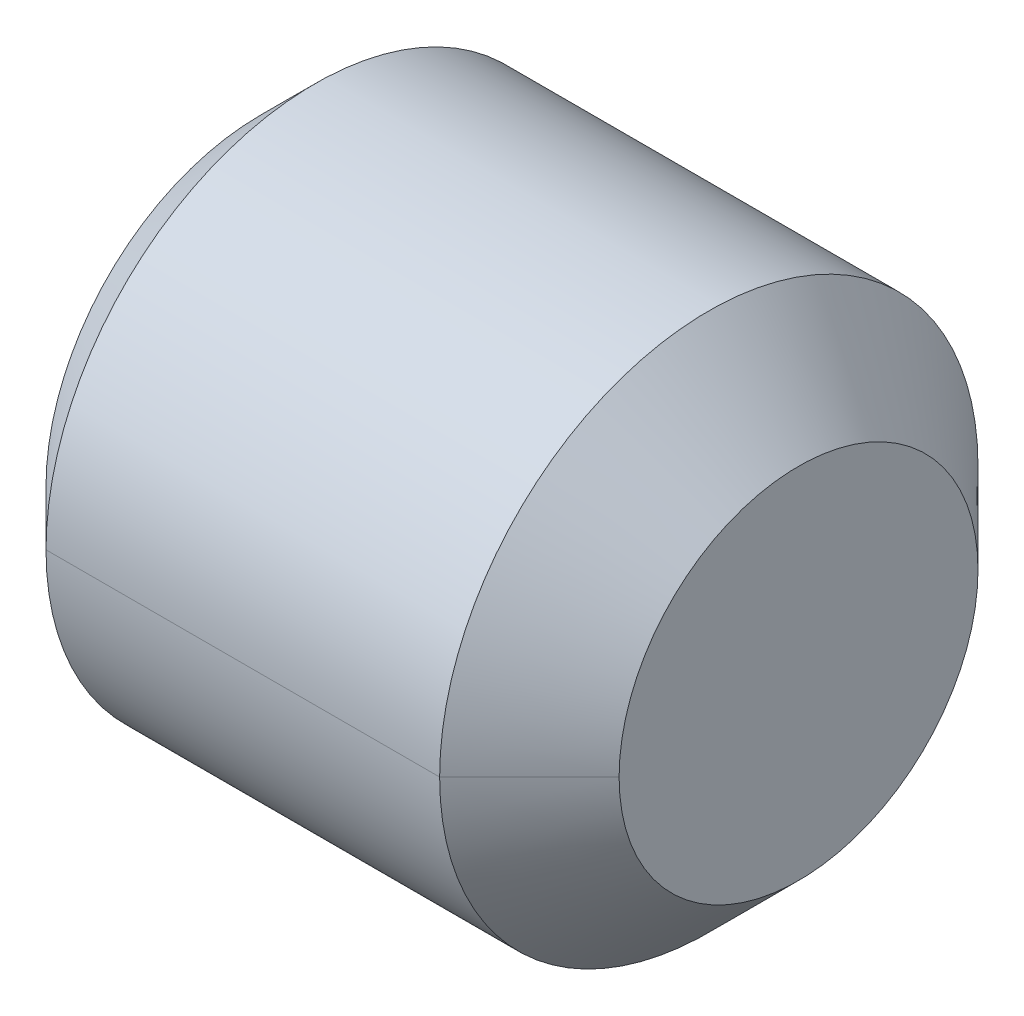
ISO-10303-21;
HEADER;
FILE_DESCRIPTION(('STEP AP214'),'2;1');
FILE_NAME('part.step','',(''),(''),'','','');
FILE_SCHEMA(('AUTOMOTIVE_DESIGN { 1 0 10303 214 1 1 1 1 }'));
ENDSEC;
DATA;
#1=APPLICATION_CONTEXT('core data for automotive mechanical design processes');
#2=APPLICATION_PROTOCOL_DEFINITION('international standard','automotive_design',2000,#1);
#3=PRODUCT_CONTEXT('',#1,'mechanical');
#4=PRODUCT('Part','Part','',(#3));
#5=PRODUCT_RELATED_PRODUCT_CATEGORY('part','',(#4));
#6=PRODUCT_DEFINITION_FORMATION('','',#4);
#7=PRODUCT_DEFINITION_CONTEXT('part definition',#1,'design');
#8=PRODUCT_DEFINITION('design','',#6,#7);
#9=PRODUCT_DEFINITION_SHAPE('','',#8);
#10=(LENGTH_UNIT() NAMED_UNIT(*) SI_UNIT(.MILLI.,.METRE.));
#11=(NAMED_UNIT(*) PLANE_ANGLE_UNIT() SI_UNIT($,.RADIAN.));
#12=(NAMED_UNIT(*) SI_UNIT($,.STERADIAN.) SOLID_ANGLE_UNIT());
#13=UNCERTAINTY_MEASURE_WITH_UNIT(LENGTH_MEASURE(1.E-05),#10,'distance_accuracy_value','');
#14=(GEOMETRIC_REPRESENTATION_CONTEXT(3) GLOBAL_UNCERTAINTY_ASSIGNED_CONTEXT((#13)) GLOBAL_UNIT_ASSIGNED_CONTEXT((#10,
#11,#12)) REPRESENTATION_CONTEXT('',''));
#15=CARTESIAN_POINT('',(0.,0.,0.));
#16=DIRECTION('',(0.,0.,1.));
#17=DIRECTION('',(1.,0.,0.));
#18=AXIS2_PLACEMENT_3D('',#15,#16,#17);
#19=CARTESIAN_POINT('',(-1.8,0.,0.));
#20=DIRECTION('',(-1.,0.,0.));
#21=DIRECTION('',(0.,0.,1.));
#22=AXIS2_PLACEMENT_3D('',#19,#20,#21);
#23=PLANE('',#22);
#24=DIRECTION('',(0.,0.866025403784438,0.5));
#25=VECTOR('',#24,1.);
#26=CARTESIAN_POINT('',(-1.8,-0.75,0.43301270189222));
#27=LINE('',#26,#25);
#28=CARTESIAN_POINT('',(-1.8,-0.75,0.43301270189222));
#29=VERTEX_POINT('',#28);
#30=CARTESIAN_POINT('',(-1.8,-0.375,0.64951905283833));
#31=VERTEX_POINT('',#30);
#32=EDGE_CURVE('E11',#29,#31,#27,.T.);
#33=ORIENTED_EDGE('',*,*,#32,.T.);
#34=CARTESIAN_POINT('',(-1.8,0.,0.));
#35=DIRECTION('',(1.,0.,0.));
#36=DIRECTION('',(0.,0.,1.));
#37=AXIS2_PLACEMENT_3D('',#34,#35,#36);
#38=CIRCLE('',#37,0.75);
#39=CARTESIAN_POINT('',(-1.8,-0.75,0.));
#40=VERTEX_POINT('',#39);
#41=EDGE_CURVE('E24',#31,#40,#38,.T.);
#42=ORIENTED_EDGE('',*,*,#41,.T.);
#43=DIRECTION('',(0.,0.,1.));
#44=VECTOR('',#43,1.);
#45=CARTESIAN_POINT('',(-1.8,-0.75,-0.43301270189222));
#46=LINE('',#45,#44);
#47=EDGE_CURVE('E333',#40,#29,#46,.T.);
#48=ORIENTED_EDGE('',*,*,#47,.T.);
#49=EDGE_LOOP('',(#33,#42,#48));
#50=FACE_BOUND('',#49,.T.);
#51=ADVANCED_FACE('F16',(#50),#23,.T.);
#52=CARTESIAN_POINT('',(-1.8,-0.75,-0.43301270189222));
#53=DIRECTION('',(0.,-1.,0.));
#54=DIRECTION('',(0.,0.,-1.));
#55=AXIS2_PLACEMENT_3D('',#52,#53,#54);
#56=PLANE('',#55);
#57=DIRECTION('',(0.,0.,1.));
#58=VECTOR('',#57,1.);
#59=CARTESIAN_POINT('',(-3.,-0.75,-0.43301270189222));
#60=LINE('',#59,#58);
#61=CARTESIAN_POINT('',(-3.,-0.75,-0.43301270189222));
#62=VERTEX_POINT('',#61);
#63=CARTESIAN_POINT('',(-3.,-0.75,0.43301270189222));
#64=VERTEX_POINT('',#63);
#65=EDGE_CURVE('E329',#62,#64,#60,.T.);
#66=ORIENTED_EDGE('',*,*,#65,.T.);
#67=DIRECTION('',(-1.,0.,0.));
#68=VECTOR('',#67,1.);
#69=CARTESIAN_POINT('',(-1.8,-0.75,0.43301270189222));
#70=LINE('',#69,#68);
#71=EDGE_CURVE('E324',#29,#64,#70,.T.);
#72=ORIENTED_EDGE('',*,*,#71,.F.);
#73=ORIENTED_EDGE('',*,*,#47,.F.);
#74=DIRECTION('',(0.,0.,1.));
#75=VECTOR('',#74,1.);
#76=CARTESIAN_POINT('',(-1.8,-0.75,-0.43301270189222));
#77=LINE('',#76,#75);
#78=CARTESIAN_POINT('',(-1.8,-0.75,-0.43301270189222));
#79=VERTEX_POINT('',#78);
#80=EDGE_CURVE('E319',#79,#40,#77,.T.);
#81=ORIENTED_EDGE('',*,*,#80,.F.);
#82=DIRECTION('',(-1.,0.,0.));
#83=VECTOR('',#82,1.);
#84=CARTESIAN_POINT('',(-1.8,-0.75,-0.43301270189222));
#85=LINE('',#84,#83);
#86=EDGE_CURVE('E315',#79,#62,#85,.T.);
#87=ORIENTED_EDGE('',*,*,#86,.T.);
#88=EDGE_LOOP('',(#66,#72,#73,#81,#87));
#89=FACE_BOUND('',#88,.T.);
#90=ADVANCED_FACE('F344',(#89),#56,.F.);
#91=CARTESIAN_POINT('',(-1.8,0.,-0.86602540378444));
#92=DIRECTION('',(0.,-0.5,-0.866025403784439));
#93=DIRECTION('',(0.,0.866025403784439,-0.5));
#94=AXIS2_PLACEMENT_3D('',#91,#92,#93);
#95=PLANE('',#94);
#96=DIRECTION('',(0.,-0.866025403784438,0.5));
#97=VECTOR('',#96,1.);
#98=CARTESIAN_POINT('',(-3.,0.,-0.86602540378444));
#99=LINE('',#98,#97);
#100=CARTESIAN_POINT('',(-3.,0.,-0.86602540378444));
#101=VERTEX_POINT('',#100);
#102=EDGE_CURVE('E310',#101,#62,#99,.T.);
#103=ORIENTED_EDGE('',*,*,#102,.T.);
#104=ORIENTED_EDGE('',*,*,#86,.F.);
#105=DIRECTION('',(0.,-0.866025403784438,0.5));
#106=VECTOR('',#105,1.);
#107=CARTESIAN_POINT('',(-1.8,0.,-0.86602540378444));
#108=LINE('',#107,#106);
#109=CARTESIAN_POINT('',(-1.8,-0.375,-0.649519052838329));
#110=VERTEX_POINT('',#109);
#111=EDGE_CURVE('E305',#110,#79,#108,.T.);
#112=ORIENTED_EDGE('',*,*,#111,.F.);
#113=DIRECTION('',(0.,-0.866025403784438,0.5));
#114=VECTOR('',#113,1.);
#115=CARTESIAN_POINT('',(-1.8,0.,-0.86602540378444));
#116=LINE('',#115,#114);
#117=CARTESIAN_POINT('',(-1.8,0.,-0.86602540378444));
#118=VERTEX_POINT('',#117);
#119=EDGE_CURVE('E300',#118,#110,#116,.T.);
#120=ORIENTED_EDGE('',*,*,#119,.F.);
#121=DIRECTION('',(-1.,0.,0.));
#122=VECTOR('',#121,1.);
#123=CARTESIAN_POINT('',(-1.8,0.,-0.86602540378444));
#124=LINE('',#123,#122);
#125=EDGE_CURVE('E296',#118,#101,#124,.T.);
#126=ORIENTED_EDGE('',*,*,#125,.T.);
#127=EDGE_LOOP('',(#103,#104,#112,#120,#126));
#128=FACE_BOUND('',#127,.T.);
#129=ADVANCED_FACE('F362',(#128),#95,.F.);
#130=CARTESIAN_POINT('',(-1.8,0.75,-0.43301270189222));
#131=DIRECTION('',(0.,0.5,-0.866025403784439));
#132=DIRECTION('',(0.,0.866025403784439,0.5));
#133=AXIS2_PLACEMENT_3D('',#130,#131,#132);
#134=PLANE('',#133);
#135=DIRECTION('',(0.,-0.866025403784438,-0.5));
#136=VECTOR('',#135,1.);
#137=CARTESIAN_POINT('',(-3.,0.75,-0.43301270189222));
#138=LINE('',#137,#136);
#139=CARTESIAN_POINT('',(-3.,0.75,-0.43301270189222));
#140=VERTEX_POINT('',#139);
#141=EDGE_CURVE('E291',#140,#101,#138,.T.);
#142=ORIENTED_EDGE('',*,*,#141,.T.);
#143=ORIENTED_EDGE('',*,*,#125,.F.);
#144=DIRECTION('',(0.,-0.866025403784438,-0.5));
#145=VECTOR('',#144,1.);
#146=CARTESIAN_POINT('',(-1.8,0.75,-0.43301270189222));
#147=LINE('',#146,#145);
#148=CARTESIAN_POINT('',(-1.8,0.375,-0.649519052838329));
#149=VERTEX_POINT('',#148);
#150=EDGE_CURVE('E286',#149,#118,#147,.T.);
#151=ORIENTED_EDGE('',*,*,#150,.F.);
#152=DIRECTION('',(0.,-0.866025403784438,-0.5));
#153=VECTOR('',#152,1.);
#154=CARTESIAN_POINT('',(-1.8,0.75,-0.43301270189222));
#155=LINE('',#154,#153);
#156=CARTESIAN_POINT('',(-1.8,0.75,-0.43301270189222));
#157=VERTEX_POINT('',#156);
#158=EDGE_CURVE('E281',#157,#149,#155,.T.);
#159=ORIENTED_EDGE('',*,*,#158,.F.);
#160=DIRECTION('',(-1.,0.,0.));
#161=VECTOR('',#160,1.);
#162=CARTESIAN_POINT('',(-1.8,0.75,-0.43301270189222));
#163=LINE('',#162,#161);
#164=EDGE_CURVE('E277',#157,#140,#163,.T.);
#165=ORIENTED_EDGE('',*,*,#164,.T.);
#166=EDGE_LOOP('',(#142,#143,#151,#159,#165));
#167=FACE_BOUND('',#166,.T.);
#168=ADVANCED_FACE('F382',(#167),#134,.F.);
#169=CARTESIAN_POINT('',(-1.8,0.75,0.43301270189222));
#170=DIRECTION('',(0.,1.,0.));
#171=DIRECTION('',(0.,0.,1.));
#172=AXIS2_PLACEMENT_3D('',#169,#170,#171);
#173=PLANE('',#172);
#174=DIRECTION('',(-1.,0.,0.));
#175=VECTOR('',#174,1.);
#176=CARTESIAN_POINT('',(-1.8,0.75,0.43301270189222));
#177=LINE('',#176,#175);
#178=CARTESIAN_POINT('',(-1.8,0.75,0.43301270189222));
#179=VERTEX_POINT('',#178);
#180=CARTESIAN_POINT('',(-3.,0.75,0.43301270189222));
#181=VERTEX_POINT('',#180);
#182=EDGE_CURVE('E273',#179,#181,#177,.T.);
#183=ORIENTED_EDGE('',*,*,#182,.T.);
#184=DIRECTION('',(0.,0.,1.));
#185=VECTOR('',#184,1.);
#186=CARTESIAN_POINT('',(-3.,0.75,0.));
#187=LINE('',#186,#185);
#188=EDGE_CURVE('E268',#140,#181,#187,.T.);
#189=ORIENTED_EDGE('',*,*,#188,.F.);
#190=ORIENTED_EDGE('',*,*,#164,.F.);
#191=DIRECTION('',(0.,0.,-1.));
#192=VECTOR('',#191,1.);
#193=CARTESIAN_POINT('',(-1.8,0.75,0.43301270189222));
#194=LINE('',#193,#192);
#195=CARTESIAN_POINT('',(-1.8,0.75,0.));
#196=VERTEX_POINT('',#195);
#197=EDGE_CURVE('E263',#196,#157,#194,.T.);
#198=ORIENTED_EDGE('',*,*,#197,.F.);
#199=DIRECTION('',(0.,0.,-1.));
#200=VECTOR('',#199,1.);
#201=CARTESIAN_POINT('',(-1.8,0.75,0.43301270189222));
#202=LINE('',#201,#200);
#203=EDGE_CURVE('E258',#179,#196,#202,.T.);
#204=ORIENTED_EDGE('',*,*,#203,.F.);
#205=EDGE_LOOP('',(#183,#189,#190,#198,#204));
#206=FACE_BOUND('',#205,.T.);
#207=ADVANCED_FACE('F385',(#206),#173,.F.);
#208=CARTESIAN_POINT('',(-1.8,0.,0.));
#209=DIRECTION('',(-1.,0.,0.));
#210=DIRECTION('',(0.,0.,1.));
#211=AXIS2_PLACEMENT_3D('',#208,#209,#210);
#212=PLANE('',#211);
#213=ORIENTED_EDGE('',*,*,#203,.T.);
#214=CARTESIAN_POINT('',(-1.8,0.,0.));
#215=DIRECTION('',(1.,0.,0.));
#216=DIRECTION('',(0.,0.,-1.));
#217=AXIS2_PLACEMENT_3D('',#214,#215,#216);
#218=CIRCLE('',#217,0.75);
#219=CARTESIAN_POINT('',(-1.8,0.375,0.649519052838329));
#220=VERTEX_POINT('',#219);
#221=EDGE_CURVE('E254',#196,#220,#218,.T.);
#222=ORIENTED_EDGE('',*,*,#221,.T.);
#223=DIRECTION('',(0.,0.866025403784438,-0.5));
#224=VECTOR('',#223,1.);
#225=CARTESIAN_POINT('',(-1.8,0.,0.86602540378444));
#226=LINE('',#225,#224);
#227=EDGE_CURVE('E249',#220,#179,#226,.T.);
#228=ORIENTED_EDGE('',*,*,#227,.T.);
#229=EDGE_LOOP('',(#213,#222,#228));
#230=FACE_BOUND('',#229,.T.);
#231=ADVANCED_FACE('F387',(#230),#212,.T.);
#232=CARTESIAN_POINT('',(-1.8,0.,0.86602540378444));
#233=DIRECTION('',(0.,0.5,0.866025403784439));
#234=DIRECTION('',(0.,-0.866025403784439,0.5));
#235=AXIS2_PLACEMENT_3D('',#232,#233,#234);
#236=PLANE('',#235);
#237=DIRECTION('',(0.,0.866025403784438,-0.5));
#238=VECTOR('',#237,1.);
#239=CARTESIAN_POINT('',(-3.,0.,0.86602540378444));
#240=LINE('',#239,#238);
#241=CARTESIAN_POINT('',(-3.,0.,0.86602540378444));
#242=VERTEX_POINT('',#241);
#243=EDGE_CURVE('E244',#242,#181,#240,.T.);
#244=ORIENTED_EDGE('',*,*,#243,.T.);
#245=ORIENTED_EDGE('',*,*,#182,.F.);
#246=ORIENTED_EDGE('',*,*,#227,.F.);
#247=DIRECTION('',(0.,0.866025403784438,-0.5));
#248=VECTOR('',#247,1.);
#249=CARTESIAN_POINT('',(-1.8,0.,0.86602540378444));
#250=LINE('',#249,#248);
#251=CARTESIAN_POINT('',(-1.8,0.,0.86602540378444));
#252=VERTEX_POINT('',#251);
#253=EDGE_CURVE('E239',#252,#220,#250,.T.);
#254=ORIENTED_EDGE('',*,*,#253,.F.);
#255=DIRECTION('',(-1.,0.,0.));
#256=VECTOR('',#255,1.);
#257=CARTESIAN_POINT('',(-1.8,0.,0.86602540378444));
#258=LINE('',#257,#256);
#259=EDGE_CURVE('E235',#252,#242,#258,.T.);
#260=ORIENTED_EDGE('',*,*,#259,.T.);
#261=EDGE_LOOP('',(#244,#245,#246,#254,#260));
#262=FACE_BOUND('',#261,.T.);
#263=ADVANCED_FACE('F371',(#262),#236,.F.);
#264=CARTESIAN_POINT('',(-1.8,-0.75,0.43301270189222));
#265=DIRECTION('',(0.,-0.5,0.866025403784439));
#266=DIRECTION('',(0.,-0.866025403784439,-0.5));
#267=AXIS2_PLACEMENT_3D('',#264,#265,#266);
#268=PLANE('',#267);
#269=DIRECTION('',(0.,0.866025403784438,0.5));
#270=VECTOR('',#269,1.);
#271=CARTESIAN_POINT('',(-3.,-0.75,0.43301270189222));
#272=LINE('',#271,#270);
#273=EDGE_CURVE('E230',#64,#242,#272,.T.);
#274=ORIENTED_EDGE('',*,*,#273,.T.);
#275=ORIENTED_EDGE('',*,*,#259,.F.);
#276=DIRECTION('',(0.,0.866025403784438,0.5));
#277=VECTOR('',#276,1.);
#278=CARTESIAN_POINT('',(-1.8,-0.75,0.43301270189222));
#279=LINE('',#278,#277);
#280=EDGE_CURVE('E225',#31,#252,#279,.T.);
#281=ORIENTED_EDGE('',*,*,#280,.F.);
#282=ORIENTED_EDGE('',*,*,#32,.F.);
#283=ORIENTED_EDGE('',*,*,#71,.T.);
#284=EDGE_LOOP('',(#274,#275,#281,#282,#283));
#285=FACE_BOUND('',#284,.T.);
#286=ADVANCED_FACE('F348',(#285),#268,.F.);
#287=CARTESIAN_POINT('',(-1.8,0.,0.));
#288=DIRECTION('',(-1.,0.,0.));
#289=DIRECTION('',(0.,0.,1.));
#290=AXIS2_PLACEMENT_3D('',#287,#288,#289);
#291=PLANE('',#290);
#292=ORIENTED_EDGE('',*,*,#253,.T.);
#293=CARTESIAN_POINT('',(-1.8,0.,0.));
#294=DIRECTION('',(1.,0.,0.));
#295=DIRECTION('',(0.,0.,1.));
#296=AXIS2_PLACEMENT_3D('',#293,#294,#295);
#297=CIRCLE('',#296,0.75);
#298=CARTESIAN_POINT('',(-1.8,0.,0.75));
#299=VERTEX_POINT('',#298);
#300=EDGE_CURVE('E221',#220,#299,#297,.T.);
#301=ORIENTED_EDGE('',*,*,#300,.T.);
#302=CARTESIAN_POINT('',(-1.8,0.,0.));
#303=DIRECTION('',(1.,0.,0.));
#304=DIRECTION('',(0.,0.,1.));
#305=AXIS2_PLACEMENT_3D('',#302,#303,#304);
#306=CIRCLE('',#305,0.75);
#307=EDGE_CURVE('E216',#299,#31,#306,.T.);
#308=ORIENTED_EDGE('',*,*,#307,.T.);
#309=ORIENTED_EDGE('',*,*,#280,.T.);
#310=EDGE_LOOP('',(#292,#301,#308,#309));
#311=FACE_BOUND('',#310,.T.);
#312=ADVANCED_FACE('F352',(#311),#291,.T.);
#313=CARTESIAN_POINT('',(-1.8,0.,0.));
#314=DIRECTION('',(-1.,0.,0.));
#315=DIRECTION('',(0.,1.,0.));
#316=AXIS2_PLACEMENT_3D('',#313,#314,#315);
#317=CONICAL_SURFACE('',#316,0.75,1.04719755119662);
#318=DIRECTION('',(-0.499999999999983,0.,-0.866025403784448));
#319=VECTOR('',#318,1.);
#320=CARTESIAN_POINT('',(-1.3669872981078,0.,0.));
#321=LINE('',#320,#319);
#322=CARTESIAN_POINT('',(-1.3669872981078,0.,0.));
#323=VERTEX_POINT('',#322);
#324=CARTESIAN_POINT('',(-1.8,0.,-0.75));
#325=VERTEX_POINT('',#324);
#326=EDGE_CURVE('E212',#323,#325,#321,.T.);
#327=ORIENTED_EDGE('',*,*,#326,.T.);
#328=CARTESIAN_POINT('',(-1.8,0.,0.));
#329=DIRECTION('',(1.,0.,0.));
#330=DIRECTION('',(0.,0.,1.));
#331=AXIS2_PLACEMENT_3D('',#328,#329,#330);
#332=CIRCLE('',#331,0.75);
#333=EDGE_CURVE('E207',#110,#325,#332,.T.);
#334=ORIENTED_EDGE('',*,*,#333,.F.);
#335=CARTESIAN_POINT('',(-1.8,0.,0.));
#336=DIRECTION('',(1.,0.,0.));
#337=DIRECTION('',(0.,0.,1.));
#338=AXIS2_PLACEMENT_3D('',#335,#336,#337);
#339=CIRCLE('',#338,0.75);
#340=EDGE_CURVE('E202',#40,#110,#339,.T.);
#341=ORIENTED_EDGE('',*,*,#340,.F.);
#342=ORIENTED_EDGE('',*,*,#41,.F.);
#343=ORIENTED_EDGE('',*,*,#307,.F.);
#344=DIRECTION('',(-0.499999999999983,0.,0.866025403784448));
#345=VECTOR('',#344,1.);
#346=CARTESIAN_POINT('',(-1.3669872981078,0.,0.));
#347=LINE('',#346,#345);
#348=EDGE_CURVE('E197',#323,#299,#347,.T.);
#349=ORIENTED_EDGE('',*,*,#348,.F.);
#350=EDGE_LOOP('',(#327,#334,#341,#342,#343,#349));
#351=FACE_BOUND('',#350,.T.);
#352=ADVANCED_FACE('F355',(#351),#317,.F.);
#353=CARTESIAN_POINT('',(-1.8,0.,0.));
#354=DIRECTION('',(-1.,0.,0.));
#355=DIRECTION('',(0.,-1.,0.));
#356=AXIS2_PLACEMENT_3D('',#353,#354,#355);
#357=CONICAL_SURFACE('',#356,0.75,1.04719755119662);
#358=ORIENTED_EDGE('',*,*,#348,.T.);
#359=ORIENTED_EDGE('',*,*,#300,.F.);
#360=ORIENTED_EDGE('',*,*,#221,.F.);
#361=CARTESIAN_POINT('',(-1.8,0.,0.));
#362=DIRECTION('',(1.,0.,0.));
#363=DIRECTION('',(0.,0.,1.));
#364=AXIS2_PLACEMENT_3D('',#361,#362,#363);
#365=CIRCLE('',#364,0.75);
#366=EDGE_CURVE('E192',#149,#196,#365,.T.);
#367=ORIENTED_EDGE('',*,*,#366,.F.);
#368=CARTESIAN_POINT('',(-1.8,0.,0.));
#369=DIRECTION('',(1.,0.,0.));
#370=DIRECTION('',(0.,0.,1.));
#371=AXIS2_PLACEMENT_3D('',#368,#369,#370);
#372=CIRCLE('',#371,0.75);
#373=EDGE_CURVE('E187',#325,#149,#372,.T.);
#374=ORIENTED_EDGE('',*,*,#373,.F.);
#375=ORIENTED_EDGE('',*,*,#326,.F.);
#376=EDGE_LOOP('',(#358,#359,#360,#367,#374,#375));
#377=FACE_BOUND('',#376,.T.);
#378=ADVANCED_FACE('F375',(#377),#357,.F.);
#379=CARTESIAN_POINT('',(-1.8,0.,0.));
#380=DIRECTION('',(-1.,0.,0.));
#381=DIRECTION('',(0.,0.,1.));
#382=AXIS2_PLACEMENT_3D('',#379,#380,#381);
#383=PLANE('',#382);
#384=ORIENTED_EDGE('',*,*,#119,.T.);
#385=ORIENTED_EDGE('',*,*,#333,.T.);
#386=ORIENTED_EDGE('',*,*,#373,.T.);
#387=ORIENTED_EDGE('',*,*,#150,.T.);
#388=EDGE_LOOP('',(#384,#385,#386,#387));
#389=FACE_BOUND('',#388,.T.);
#390=ADVANCED_FACE('F380',(#389),#383,.T.);
#391=CARTESIAN_POINT('',(-1.8,0.,0.));
#392=DIRECTION('',(-1.,0.,0.));
#393=DIRECTION('',(0.,0.,1.));
#394=AXIS2_PLACEMENT_3D('',#391,#392,#393);
#395=PLANE('',#394);
#396=ORIENTED_EDGE('',*,*,#158,.T.);
#397=ORIENTED_EDGE('',*,*,#366,.T.);
#398=ORIENTED_EDGE('',*,*,#197,.T.);
#399=EDGE_LOOP('',(#396,#397,#398));
#400=FACE_BOUND('',#399,.T.);
#401=ADVANCED_FACE('F479',(#400),#395,.T.);
#402=CARTESIAN_POINT('',(-1.8,0.,0.));
#403=DIRECTION('',(-1.,0.,0.));
#404=DIRECTION('',(0.,0.,1.));
#405=AXIS2_PLACEMENT_3D('',#402,#403,#404);
#406=PLANE('',#405);
#407=ORIENTED_EDGE('',*,*,#80,.T.);
#408=ORIENTED_EDGE('',*,*,#340,.T.);
#409=ORIENTED_EDGE('',*,*,#111,.T.);
#410=EDGE_LOOP('',(#407,#408,#409));
#411=FACE_BOUND('',#410,.T.);
#412=ADVANCED_FACE('F358',(#411),#406,.T.);
#413=CARTESIAN_POINT('',(-3.,0.,0.));
#414=DIRECTION('',(1.,0.,0.));
#415=DIRECTION('',(0.,0.,-1.));
#416=AXIS2_PLACEMENT_3D('',#413,#414,#415);
#417=PLANE('',#416);
#418=CARTESIAN_POINT('',(-3.,0.,0.));
#419=DIRECTION('',(1.,0.,0.));
#420=DIRECTION('',(0.,0.,-1.));
#421=AXIS2_PLACEMENT_3D('',#418,#419,#420);
#422=CIRCLE('',#421,1.1935);
#423=CARTESIAN_POINT('',(-3.,0.,1.1935));
#424=VERTEX_POINT('',#423);
#425=CARTESIAN_POINT('',(-3.,0.,-1.1935));
#426=VERTEX_POINT('',#425);
#427=EDGE_CURVE('E182',#424,#426,#422,.T.);
#428=ORIENTED_EDGE('',*,*,#427,.F.);
#429=CARTESIAN_POINT('',(-3.,0.,0.));
#430=DIRECTION('',(1.,0.,0.));
#431=DIRECTION('',(0.,0.,-1.));
#432=AXIS2_PLACEMENT_3D('',#429,#430,#431);
#433=CIRCLE('',#432,1.1935);
#434=EDGE_CURVE('E177',#426,#424,#433,.T.);
#435=ORIENTED_EDGE('',*,*,#434,.F.);
#436=EDGE_LOOP('',(#428,#435));
#437=FACE_BOUND('',#436,.T.);
#438=ORIENTED_EDGE('',*,*,#243,.F.);
#439=ORIENTED_EDGE('',*,*,#273,.F.);
#440=ORIENTED_EDGE('',*,*,#65,.F.);
#441=ORIENTED_EDGE('',*,*,#102,.F.);
#442=ORIENTED_EDGE('',*,*,#141,.F.);
#443=ORIENTED_EDGE('',*,*,#188,.T.);
#444=EDGE_LOOP('',(#438,#439,#440,#441,#442,#443));
#445=FACE_BOUND('',#444,.T.);
#446=ADVANCED_FACE('F367',(#437,#445),#417,.F.);
#447=CARTESIAN_POINT('',(-3.,0.,0.));
#448=DIRECTION('',(1.,0.,0.));
#449=DIRECTION('',(0.,-1.,0.));
#450=AXIS2_PLACEMENT_3D('',#447,#448,#449);
#451=CONICAL_SURFACE('',#450,1.1935,0.785398163397448);
#452=DIRECTION('',(0.707106781186548,0.,0.707106781186547));
#453=VECTOR('',#452,1.);
#454=CARTESIAN_POINT('',(-3.,0.,1.1935));
#455=LINE('',#454,#453);
#456=CARTESIAN_POINT('',(-2.6935,0.,1.5));
#457=VERTEX_POINT('',#456);
#458=EDGE_CURVE('E173',#424,#457,#455,.T.);
#459=ORIENTED_EDGE('',*,*,#458,.T.);
#460=CARTESIAN_POINT('',(-2.6935,0.,0.));
#461=DIRECTION('',(1.,0.,0.));
#462=DIRECTION('',(0.,0.,-1.));
#463=AXIS2_PLACEMENT_3D('',#460,#461,#462);
#464=CIRCLE('',#463,1.5);
#465=CARTESIAN_POINT('',(-2.6935,0.,-1.5));
#466=VERTEX_POINT('',#465);
#467=EDGE_CURVE('E168',#466,#457,#464,.T.);
#468=ORIENTED_EDGE('',*,*,#467,.F.);
#469=DIRECTION('',(0.707106781186548,0.,-0.707106781186547));
#470=VECTOR('',#469,1.);
#471=CARTESIAN_POINT('',(-3.,0.,-1.1935));
#472=LINE('',#471,#470);
#473=EDGE_CURVE('E163',#426,#466,#472,.T.);
#474=ORIENTED_EDGE('',*,*,#473,.F.);
#475=ORIENTED_EDGE('',*,*,#434,.T.);
#476=EDGE_LOOP('',(#459,#468,#474,#475));
#477=FACE_BOUND('',#476,.T.);
#478=ADVANCED_FACE('F508',(#477),#451,.T.);
#479=CARTESIAN_POINT('',(-3.,0.,0.));
#480=DIRECTION('',(1.,0.,0.));
#481=DIRECTION('',(0.,1.,0.));
#482=AXIS2_PLACEMENT_3D('',#479,#480,#481);
#483=CONICAL_SURFACE('',#482,1.1935,0.785398163397448);
#484=ORIENTED_EDGE('',*,*,#458,.F.);
#485=ORIENTED_EDGE('',*,*,#427,.T.);
#486=ORIENTED_EDGE('',*,*,#473,.T.);
#487=CARTESIAN_POINT('',(-2.6935,0.,0.));
#488=DIRECTION('',(1.,0.,0.));
#489=DIRECTION('',(0.,0.,-1.));
#490=AXIS2_PLACEMENT_3D('',#487,#488,#489);
#491=CIRCLE('',#490,1.5);
#492=EDGE_CURVE('E158',#457,#466,#491,.T.);
#493=ORIENTED_EDGE('',*,*,#492,.F.);
#494=EDGE_LOOP('',(#484,#485,#486,#493));
#495=FACE_BOUND('',#494,.T.);
#496=ADVANCED_FACE('F519',(#495),#483,.T.);
#497=CARTESIAN_POINT('',(0.,0.,0.));
#498=DIRECTION('',(1.,0.,0.));
#499=DIRECTION('',(0.,1.,0.));
#500=AXIS2_PLACEMENT_3D('',#497,#498,#499);
#501=CYLINDRICAL_SURFACE('',#500,1.5);
#502=DIRECTION('',(1.,0.,0.));
#503=VECTOR('',#502,1.);
#504=CARTESIAN_POINT('',(-2.6935,0.,1.5));
#505=LINE('',#504,#503);
#506=CARTESIAN_POINT('',(-0.5,0.,1.5));
#507=VERTEX_POINT('',#506);
#508=EDGE_CURVE('E153',#457,#507,#505,.T.);
#509=ORIENTED_EDGE('',*,*,#508,.F.);
#510=ORIENTED_EDGE('',*,*,#492,.T.);
#511=DIRECTION('',(1.,0.,0.));
#512=VECTOR('',#511,1.);
#513=CARTESIAN_POINT('',(-2.6935,0.,-1.5));
#514=LINE('',#513,#512);
#515=CARTESIAN_POINT('',(-0.5,0.,-1.5));
#516=VERTEX_POINT('',#515);
#517=EDGE_CURVE('E149',#466,#516,#514,.T.);
#518=ORIENTED_EDGE('',*,*,#517,.T.);
#519=CARTESIAN_POINT('',(-0.5,0.,0.));
#520=DIRECTION('',(1.,0.,0.));
#521=DIRECTION('',(0.,0.,-1.));
#522=AXIS2_PLACEMENT_3D('',#519,#520,#521);
#523=CIRCLE('',#522,1.5);
#524=EDGE_CURVE('E145',#507,#516,#523,.T.);
#525=ORIENTED_EDGE('',*,*,#524,.F.);
#526=EDGE_LOOP('',(#509,#510,#518,#525));
#527=FACE_BOUND('',#526,.T.);
#528=ADVANCED_FACE('F530',(#527),#501,.T.);
#529=CARTESIAN_POINT('',(-0.5,0.,0.));
#530=DIRECTION('',(-1.,0.,0.));
#531=DIRECTION('',(0.,1.,0.));
#532=AXIS2_PLACEMENT_3D('',#529,#530,#531);
#533=CONICAL_SURFACE('',#532,1.5,0.785398163397448);
#534=DIRECTION('',(-0.707106781186548,0.,-0.707106781186548));
#535=VECTOR('',#534,1.);
#536=CARTESIAN_POINT('',(0.,0.,-1.));
#537=LINE('',#536,#535);
#538=CARTESIAN_POINT('',(0.,0.,-1.));
#539=VERTEX_POINT('',#538);
#540=EDGE_CURVE('E123',#539,#516,#537,.T.);
#541=ORIENTED_EDGE('',*,*,#540,.F.);
#542=CARTESIAN_POINT('',(0.,0.,0.));
#543=DIRECTION('',(1.,0.,0.));
#544=DIRECTION('',(0.,0.,-1.));
#545=AXIS2_PLACEMENT_3D('',#542,#543,#544);
#546=CIRCLE('',#545,1.);
#547=CARTESIAN_POINT('',(0.,0.,1.));
#548=VERTEX_POINT('',#547);
#549=EDGE_CURVE('E116',#548,#539,#546,.T.);
#550=ORIENTED_EDGE('',*,*,#549,.F.);
#551=DIRECTION('',(-0.707106781186548,0.,0.707106781186548));
#552=VECTOR('',#551,1.);
#553=CARTESIAN_POINT('',(0.,0.,1.));
#554=LINE('',#553,#552);
#555=EDGE_CURVE('E121',#548,#507,#554,.T.);
#556=ORIENTED_EDGE('',*,*,#555,.T.);
#557=ORIENTED_EDGE('',*,*,#524,.T.);
#558=EDGE_LOOP('',(#541,#550,#556,#557));
#559=FACE_BOUND('',#558,.T.);
#560=ADVANCED_FACE('F118',(#559),#533,.T.);
#561=CARTESIAN_POINT('',(-0.5,0.,0.));
#562=DIRECTION('',(-1.,0.,0.));
#563=DIRECTION('',(0.,-1.,0.));
#564=AXIS2_PLACEMENT_3D('',#561,#562,#563);
#565=CONICAL_SURFACE('',#564,1.5,0.785398163397448);
#566=ORIENTED_EDGE('',*,*,#540,.T.);
#567=CARTESIAN_POINT('',(-0.5,0.,0.));
#568=DIRECTION('',(1.,0.,0.));
#569=DIRECTION('',(0.,0.,-1.));
#570=AXIS2_PLACEMENT_3D('',#567,#568,#569);
#571=CIRCLE('',#570,1.5);
#572=EDGE_CURVE('E130',#516,#507,#571,.T.);
#573=ORIENTED_EDGE('',*,*,#572,.T.);
#574=ORIENTED_EDGE('',*,*,#555,.F.);
#575=CARTESIAN_POINT('',(0.,0.,0.));
#576=DIRECTION('',(1.,0.,0.));
#577=DIRECTION('',(0.,0.,-1.));
#578=AXIS2_PLACEMENT_3D('',#575,#576,#577);
#579=CIRCLE('',#578,1.);
#580=EDGE_CURVE('E127',#539,#548,#579,.T.);
#581=ORIENTED_EDGE('',*,*,#580,.F.);
#582=EDGE_LOOP('',(#566,#573,#574,#581));
#583=FACE_BOUND('',#582,.T.);
#584=ADVANCED_FACE('F133',(#583),#565,.T.);
#585=CARTESIAN_POINT('',(0.,1.,0.));
#586=DIRECTION('',(-1.,0.,0.));
#587=DIRECTION('',(0.,0.,1.));
#588=AXIS2_PLACEMENT_3D('',#585,#586,#587);
#589=PLANE('',#588);
#590=ORIENTED_EDGE('',*,*,#580,.T.);
#591=ORIENTED_EDGE('',*,*,#549,.T.);
#592=EDGE_LOOP('',(#590,#591));
#593=FACE_BOUND('',#592,.T.);
#594=ADVANCED_FACE('F128',(#593),#589,.F.);
#595=CARTESIAN_POINT('',(0.,0.,0.));
#596=DIRECTION('',(1.,0.,0.));
#597=DIRECTION('',(0.,-1.,0.));
#598=AXIS2_PLACEMENT_3D('',#595,#596,#597);
#599=CYLINDRICAL_SURFACE('',#598,1.5);
#600=ORIENTED_EDGE('',*,*,#508,.T.);
#601=ORIENTED_EDGE('',*,*,#572,.F.);
#602=ORIENTED_EDGE('',*,*,#517,.F.);
#603=ORIENTED_EDGE('',*,*,#467,.T.);
#604=EDGE_LOOP('',(#600,#601,#602,#603));
#605=FACE_BOUND('',#604,.T.);
#606=ADVANCED_FACE('F569',(#605),#599,.T.);
#607=CLOSED_SHELL('',(#51,#90,#129,#168,#207,#231,#263,#286,#312,#352,#378,#390,#401,#412,#446,
#478,#496,#528,#560,#584,#594,#606));
#608=MANIFOLD_SOLID_BREP('B1',#607);
#609=ADVANCED_BREP_SHAPE_REPRESENTATION('',(#18,#608),#14);
#610=SHAPE_DEFINITION_REPRESENTATION(#9,#609);
ENDSEC;
END-ISO-10303-21;
